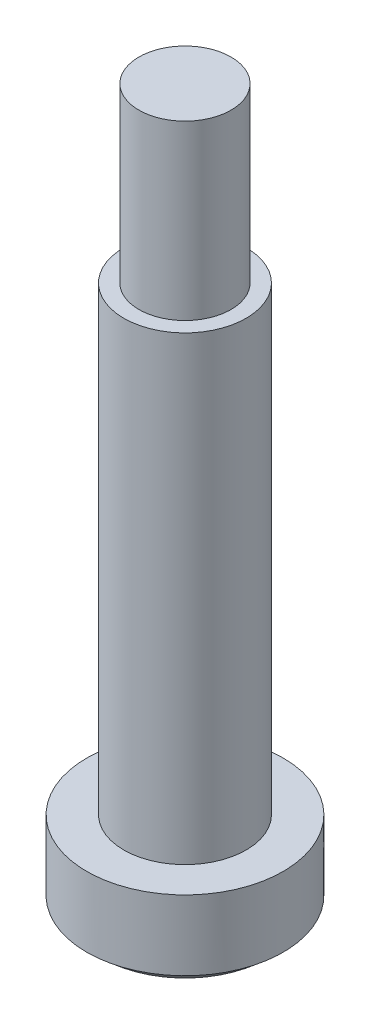
ISO-10303-21;
HEADER;
FILE_DESCRIPTION(('STEP AP214'),'2;1');
FILE_NAME('part.step','',(''),(''),'','','');
FILE_SCHEMA(('AUTOMOTIVE_DESIGN { 1 0 10303 214 1 1 1 1 }'));
ENDSEC;
DATA;
#1=APPLICATION_CONTEXT('core data for automotive mechanical design processes');
#2=APPLICATION_PROTOCOL_DEFINITION('international standard','automotive_design',2000,#1);
#3=PRODUCT_CONTEXT('',#1,'mechanical');
#4=PRODUCT('Part','Part','',(#3));
#5=PRODUCT_RELATED_PRODUCT_CATEGORY('part','',(#4));
#6=PRODUCT_DEFINITION_FORMATION('','',#4);
#7=PRODUCT_DEFINITION_CONTEXT('part definition',#1,'design');
#8=PRODUCT_DEFINITION('design','',#6,#7);
#9=PRODUCT_DEFINITION_SHAPE('','',#8);
#10=(LENGTH_UNIT() NAMED_UNIT(*) SI_UNIT(.MILLI.,.METRE.));
#11=(NAMED_UNIT(*) PLANE_ANGLE_UNIT() SI_UNIT($,.RADIAN.));
#12=(NAMED_UNIT(*) SI_UNIT($,.STERADIAN.) SOLID_ANGLE_UNIT());
#13=UNCERTAINTY_MEASURE_WITH_UNIT(LENGTH_MEASURE(1.E-05),#10,'distance_accuracy_value','');
#14=(GEOMETRIC_REPRESENTATION_CONTEXT(3) GLOBAL_UNCERTAINTY_ASSIGNED_CONTEXT((#13)) GLOBAL_UNIT_ASSIGNED_CONTEXT((#10,
#11,#12)) REPRESENTATION_CONTEXT('',''));
#15=CARTESIAN_POINT('',(0.,0.,0.));
#16=DIRECTION('',(0.,0.,1.));
#17=DIRECTION('',(1.,0.,0.));
#18=AXIS2_PLACEMENT_3D('',#15,#16,#17);
#19=CARTESIAN_POINT('',(0.,5.4,0.));
#20=DIRECTION('',(0.,-1.,0.));
#21=DIRECTION('',(0.,0.,-1.));
#22=AXIS2_PLACEMENT_3D('',#19,#20,#21);
#23=CYLINDRICAL_SURFACE('',#22,6.4);
#24=CARTESIAN_POINT('',(0.,0.839099631177299,0.));
#25=DIRECTION('',(0.,1.,0.));
#26=DIRECTION('',(0.,0.,1.));
#27=AXIS2_PLACEMENT_3D('',#24,#25,#26);
#28=CIRCLE('',#27,6.4);
#29=CARTESIAN_POINT('',(0.,0.839099631177298,-6.4));
#30=VERTEX_POINT('',#29);
#31=EDGE_CURVE('E50',#30,#30,#28,.T.);
#32=CARTESIAN_POINT('',(0.,5.4,0.));
#33=DIRECTION('',(0.,1.,0.));
#34=DIRECTION('',(0.,0.,1.));
#35=AXIS2_PLACEMENT_3D('',#32,#33,#34);
#36=CIRCLE('',#35,6.4);
#37=CARTESIAN_POINT('',(0.,5.4,-6.4));
#38=VERTEX_POINT('',#37);
#39=EDGE_CURVE('E159',#38,#38,#36,.T.);
#40=CARTESIAN_POINT('',(0.,0.839099631177298,-6.4));
#41=CARTESIAN_POINT('',(0.,0.886609010019201,-6.4));
#42=CARTESIAN_POINT('',(0.,0.934118388861105,-6.4));
#43=CARTESIAN_POINT('',(0.,1.02913714654491,-6.4));
#44=CARTESIAN_POINT('',(0.,1.07664652538681,-6.4));
#45=CARTESIAN_POINT('',(0.,1.17166528307062,-6.4));
#46=CARTESIAN_POINT('',(0.,1.21917466191252,-6.4));
#47=CARTESIAN_POINT('',(0.,1.31419341959633,-6.4));
#48=CARTESIAN_POINT('',(0.,1.36170279843823,-6.4));
#49=CARTESIAN_POINT('',(0.,1.45672155612204,-6.4));
#50=CARTESIAN_POINT('',(0.,1.50423093496394,-6.4));
#51=CARTESIAN_POINT('',(0.,1.59924969264775,-6.4));
#52=CARTESIAN_POINT('',(0.,1.64675907148965,-6.4));
#53=CARTESIAN_POINT('',(0.,1.74177782917346,-6.4));
#54=CARTESIAN_POINT('',(0.,1.78928720801536,-6.4));
#55=CARTESIAN_POINT('',(0.,1.88430596569917,-6.4));
#56=CARTESIAN_POINT('',(0.,1.93181534454107,-6.4));
#57=CARTESIAN_POINT('',(0.,2.02683410222488,-6.4));
#58=CARTESIAN_POINT('',(0.,2.07434348106678,-6.4));
#59=CARTESIAN_POINT('',(0.,2.16936223875059,-6.4));
#60=CARTESIAN_POINT('',(0.,2.21687161759249,-6.4));
#61=CARTESIAN_POINT('',(0.,2.3118903752763,-6.4));
#62=CARTESIAN_POINT('',(0.,2.3593997541182,-6.4));
#63=CARTESIAN_POINT('',(0.,2.45441851180201,-6.4));
#64=CARTESIAN_POINT('',(0.,2.50192789064391,-6.4));
#65=CARTESIAN_POINT('',(0.,2.59694664832771,-6.4));
#66=CARTESIAN_POINT('',(0.,2.64445602716962,-6.4));
#67=CARTESIAN_POINT('',(0.,2.73947478485342,-6.4));
#68=CARTESIAN_POINT('',(0.,2.78698416369533,-6.4));
#69=CARTESIAN_POINT('',(0.,2.88200292137913,-6.4));
#70=CARTESIAN_POINT('',(0.,2.92951230022104,-6.4));
#71=CARTESIAN_POINT('',(0.,3.02453105790484,-6.4));
#72=CARTESIAN_POINT('',(0.,3.07204043674675,-6.4));
#73=CARTESIAN_POINT('',(0.,3.16705919443055,-6.4));
#74=CARTESIAN_POINT('',(0.,3.21456857327246,-6.4));
#75=CARTESIAN_POINT('',(0.,3.30958733095626,-6.4));
#76=CARTESIAN_POINT('',(0.,3.35709670979816,-6.4));
#77=CARTESIAN_POINT('',(0.,3.45211546748197,-6.4));
#78=CARTESIAN_POINT('',(0.,3.49962484632387,-6.4));
#79=CARTESIAN_POINT('',(0.,3.59464360400768,-6.4));
#80=CARTESIAN_POINT('',(0.,3.64215298284958,-6.4));
#81=CARTESIAN_POINT('',(0.,3.73717174053339,-6.4));
#82=CARTESIAN_POINT('',(0.,3.78468111937529,-6.4));
#83=CARTESIAN_POINT('',(0.,3.8796998770591,-6.4));
#84=CARTESIAN_POINT('',(0.,3.927209255901,-6.4));
#85=CARTESIAN_POINT('',(0.,4.02222801358481,-6.4));
#86=CARTESIAN_POINT('',(0.,4.06973739242671,-6.4));
#87=CARTESIAN_POINT('',(0.,4.16475615011052,-6.4));
#88=CARTESIAN_POINT('',(0.,4.21226552895242,-6.4));
#89=CARTESIAN_POINT('',(0.,4.30728428663623,-6.4));
#90=CARTESIAN_POINT('',(0.,4.35479366547813,-6.4));
#91=CARTESIAN_POINT('',(0.,4.44981242316194,-6.4));
#92=CARTESIAN_POINT('',(0.,4.49732180200384,-6.4));
#93=CARTESIAN_POINT('',(0.,4.59234055968765,-6.4));
#94=CARTESIAN_POINT('',(0.,4.63984993852955,-6.4));
#95=CARTESIAN_POINT('',(0.,4.73486869621336,-6.4));
#96=CARTESIAN_POINT('',(0.,4.78237807505526,-6.4));
#97=CARTESIAN_POINT('',(0.,4.87739683273907,-6.4));
#98=CARTESIAN_POINT('',(0.,4.92490621158097,-6.4));
#99=CARTESIAN_POINT('',(0.,5.01992496926478,-6.4));
#100=CARTESIAN_POINT('',(0.,5.06743434810668,-6.4));
#101=CARTESIAN_POINT('',(0.,5.16245310579048,-6.4));
#102=CARTESIAN_POINT('',(0.,5.20996248463239,-6.4));
#103=CARTESIAN_POINT('',(0.,5.30498124231619,-6.4));
#104=CARTESIAN_POINT('',(0.,5.3524906211581,-6.4));
#105=CARTESIAN_POINT('',(0.,5.4,-6.4));
#106=B_SPLINE_CURVE_WITH_KNOTS('',3,(#40,#41,#42,#43,#44,#45,#46,#47,#48,#49,#50,#51,#52,#53,
#54,#55,#56,#57,#58,#59,#60,#61,#62,#63,#64,#65,#66,#67,#68,#69,#70,#71,#72,#73,#74,#75,#76,#77,
#78,#79,#80,#81,#82,#83,#84,#85,#86,#87,#88,#89,#90,#91,#92,#93,#94,#95,#96,#97,#98,#99,#100,
#101,#102,#103,#104,#105),.UNSPECIFIED.,.F.,.F.,(4,2,2,2,2,2,2,2,2,2,2,2,2,2,2,2,2,2,2,2,2,2,2,
2,2,2,2,2,2,2,2,2,4),(0.,0.142528136525709,0.285056273051419,0.427584409577128,
0.570112546102838,0.712640682628547,0.855168819154256,0.997696955679966,1.14022509220568,
1.28275322873138,1.42528136525709,1.5678095017828,1.71033763830851,1.85286577483422,
1.99539391135993,2.13792204788564,2.28045018441135,2.42297832093706,2.56550645746277,
2.70803459398848,2.85056273051419,2.9930908670399,3.13561900356561,3.27814714009132,
3.42067527661703,3.56320341314274,3.70573154966845,3.84825968619415,3.99078782271986,
4.13331595924557,4.27584409577128,4.41837223229699,4.5609003688227),.UNSPECIFIED.);
#107=EDGE_CURVE('BSEAM41',#30,#38,#106,.T.);
#108=ORIENTED_EDGE('',*,*,#31,.T.);
#109=ORIENTED_EDGE('',*,*,#39,.F.);
#110=ORIENTED_EDGE('',*,*,#107,.T.);
#111=ORIENTED_EDGE('',*,*,#107,.F.);
#112=EDGE_LOOP('',(#108,#110,#109,#111));
#113=FACE_BOUND('',#112,.T.);
#114=ADVANCED_FACE('F41',(#113),#23,.T.);
#115=CARTESIAN_POINT('',(0.,5.4,0.));
#116=DIRECTION('',(0.,1.,0.));
#117=DIRECTION('',(0.,0.,1.));
#118=AXIS2_PLACEMENT_3D('',#115,#116,#117);
#119=PLANE('',#118);
#120=CARTESIAN_POINT('',(0.,5.4,0.));
#121=DIRECTION('',(0.,1.,0.));
#122=DIRECTION('',(0.,0.,1.));
#123=AXIS2_PLACEMENT_3D('',#120,#121,#122);
#124=CIRCLE('',#123,3.985);
#125=CARTESIAN_POINT('',(0.,5.4,3.985));
#126=VERTEX_POINT('',#125);
#127=EDGE_CURVE('E156',#126,#126,#124,.T.);
#128=ORIENTED_EDGE('',*,*,#127,.F.);
#129=EDGE_LOOP('',(#128));
#130=FACE_BOUND('',#129,.T.);
#131=ORIENTED_EDGE('',*,*,#39,.T.);
#132=EDGE_LOOP('',(#131));
#133=FACE_BOUND('',#132,.T.);
#134=ADVANCED_FACE('F183',(#130,#133),#119,.T.);
#135=CARTESIAN_POINT('',(0.,0.,0.));
#136=DIRECTION('',(0.,1.,0.));
#137=DIRECTION('',(0.,0.,1.));
#138=AXIS2_PLACEMENT_3D('',#135,#136,#137);
#139=PLANE('',#138);
#140=DIRECTION('',(-0.866025403784438,0.,-0.5));
#141=VECTOR('',#140,1.);
#142=CARTESIAN_POINT('',(0.,0.,2.30940107675851));
#143=LINE('',#142,#141);
#144=CARTESIAN_POINT('',(0.,0.,2.30940107675851));
#145=VERTEX_POINT('',#144);
#146=CARTESIAN_POINT('',(-2.,0.,1.15470053837925));
#147=VERTEX_POINT('',#146);
#148=EDGE_CURVE('E131',#145,#147,#143,.T.);
#149=ORIENTED_EDGE('',*,*,#148,.F.);
#150=DIRECTION('',(-0.866025403784438,0.,0.5));
#151=VECTOR('',#150,1.);
#152=CARTESIAN_POINT('',(2.,0.,1.15470053837925));
#153=LINE('',#152,#151);
#154=CARTESIAN_POINT('',(2.,0.,1.15470053837925));
#155=VERTEX_POINT('',#154);
#156=EDGE_CURVE('E57',#155,#145,#153,.T.);
#157=ORIENTED_EDGE('',*,*,#156,.F.);
#158=DIRECTION('',(0.,0.,1.));
#159=VECTOR('',#158,1.);
#160=CARTESIAN_POINT('',(2.,0.,-1.15470053837925));
#161=LINE('',#160,#159);
#162=CARTESIAN_POINT('',(2.,0.,-1.15470053837925));
#163=VERTEX_POINT('',#162);
#164=EDGE_CURVE('E140',#163,#155,#161,.T.);
#165=ORIENTED_EDGE('',*,*,#164,.F.);
#166=DIRECTION('',(0.866025403784439,0.,0.5));
#167=VECTOR('',#166,1.);
#168=CARTESIAN_POINT('',(0.,0.,-2.30940107675851));
#169=LINE('',#168,#167);
#170=CARTESIAN_POINT('',(0.,0.,-2.30940107675851));
#171=VERTEX_POINT('',#170);
#172=EDGE_CURVE('E138',#171,#163,#169,.T.);
#173=ORIENTED_EDGE('',*,*,#172,.F.);
#174=DIRECTION('',(0.866025403784438,0.,-0.5));
#175=VECTOR('',#174,1.);
#176=CARTESIAN_POINT('',(-2.,0.,-1.15470053837925));
#177=LINE('',#176,#175);
#178=CARTESIAN_POINT('',(-2.,0.,-1.15470053837925));
#179=VERTEX_POINT('',#178);
#180=EDGE_CURVE('E105',#179,#171,#177,.T.);
#181=ORIENTED_EDGE('',*,*,#180,.F.);
#182=DIRECTION('',(0.,0.,-1.));
#183=VECTOR('',#182,1.);
#184=CARTESIAN_POINT('',(-2.,0.,1.15470053837925));
#185=LINE('',#184,#183);
#186=EDGE_CURVE('E134',#147,#179,#185,.T.);
#187=ORIENTED_EDGE('',*,*,#186,.F.);
#188=EDGE_LOOP('',(#149,#157,#165,#173,#181,#187));
#189=FACE_BOUND('',#188,.T.);
#190=CARTESIAN_POINT('',(0.,0.,0.));
#191=DIRECTION('',(0.,1.,0.));
#192=DIRECTION('',(0.,0.,1.));
#193=AXIS2_PLACEMENT_3D('',#190,#191,#192);
#194=CIRCLE('',#193,5.39999999999997);
#195=CARTESIAN_POINT('',(0.,0.,5.39999999999997));
#196=VERTEX_POINT('',#195);
#197=EDGE_CURVE('E11',#196,#196,#194,.F.);
#198=ORIENTED_EDGE('',*,*,#197,.T.);
#199=EDGE_LOOP('',(#198));
#200=FACE_BOUND('',#199,.T.);
#201=ADVANCED_FACE('F187',(#189,#200),#139,.F.);
#202=CARTESIAN_POINT('',(0.,35.4,0.));
#203=DIRECTION('',(0.,-1.,0.));
#204=DIRECTION('',(0.,0.,-1.));
#205=AXIS2_PLACEMENT_3D('',#202,#203,#204);
#206=CYLINDRICAL_SURFACE('',#205,3.985);
#207=CARTESIAN_POINT('',(0.,35.4,0.));
#208=DIRECTION('',(0.,1.,0.));
#209=DIRECTION('',(0.,0.,1.));
#210=AXIS2_PLACEMENT_3D('',#207,#208,#209);
#211=CIRCLE('',#210,3.985);
#212=CARTESIAN_POINT('',(0.,35.4,3.985));
#213=VERTEX_POINT('',#212);
#214=EDGE_CURVE('E152',#213,#213,#211,.T.);
#215=ORIENTED_EDGE('',*,*,#214,.F.);
#216=EDGE_LOOP('',(#215));
#217=FACE_BOUND('',#216,.T.);
#218=ORIENTED_EDGE('',*,*,#127,.T.);
#219=EDGE_LOOP('',(#218));
#220=FACE_BOUND('',#219,.T.);
#221=ADVANCED_FACE('F192',(#217,#220),#206,.T.);
#222=CARTESIAN_POINT('',(0.,35.4,0.));
#223=DIRECTION('',(0.,1.,0.));
#224=DIRECTION('',(0.,0.,1.));
#225=AXIS2_PLACEMENT_3D('',#222,#223,#224);
#226=PLANE('',#225);
#227=CARTESIAN_POINT('',(0.,35.4,0.));
#228=DIRECTION('',(0.,1.,0.));
#229=DIRECTION('',(0.,0.,1.));
#230=AXIS2_PLACEMENT_3D('',#227,#228,#229);
#231=CIRCLE('',#230,3.);
#232=CARTESIAN_POINT('',(0.,35.4,-3.));
#233=VERTEX_POINT('',#232);
#234=EDGE_CURVE('E153',#233,#233,#231,.T.);
#235=ORIENTED_EDGE('',*,*,#234,.F.);
#236=EDGE_LOOP('',(#235));
#237=FACE_BOUND('',#236,.T.);
#238=ORIENTED_EDGE('',*,*,#214,.T.);
#239=EDGE_LOOP('',(#238));
#240=FACE_BOUND('',#239,.T.);
#241=ADVANCED_FACE('F197',(#237,#240),#226,.T.);
#242=CARTESIAN_POINT('',(0.,46.65,0.));
#243=DIRECTION('',(0.,-1.,0.));
#244=DIRECTION('',(0.,0.,-1.));
#245=AXIS2_PLACEMENT_3D('',#242,#243,#244);
#246=CYLINDRICAL_SURFACE('',#245,3.);
#247=CARTESIAN_POINT('',(0.,46.65,0.));
#248=DIRECTION('',(0.,1.,0.));
#249=DIRECTION('',(0.,0.,1.));
#250=AXIS2_PLACEMENT_3D('',#247,#248,#249);
#251=CIRCLE('',#250,3.);
#252=CARTESIAN_POINT('',(0.,46.65,-3.));
#253=VERTEX_POINT('',#252);
#254=EDGE_CURVE('E144',#253,#253,#251,.T.);
#255=CARTESIAN_POINT('',(0.,46.65,-3.));
#256=CARTESIAN_POINT('',(0.,46.5328125,-3.));
#257=CARTESIAN_POINT('',(0.,46.415625,-3.));
#258=CARTESIAN_POINT('',(0.,46.18125,-3.));
#259=CARTESIAN_POINT('',(0.,46.0640625,-3.));
#260=CARTESIAN_POINT('',(0.,45.8296875,-3.));
#261=CARTESIAN_POINT('',(0.,45.7125,-3.));
#262=CARTESIAN_POINT('',(0.,45.478125,-3.));
#263=CARTESIAN_POINT('',(0.,45.3609375,-3.));
#264=CARTESIAN_POINT('',(0.,45.1265625,-3.));
#265=CARTESIAN_POINT('',(0.,45.009375,-3.));
#266=CARTESIAN_POINT('',(0.,44.775,-3.));
#267=CARTESIAN_POINT('',(0.,44.6578125,-3.));
#268=CARTESIAN_POINT('',(0.,44.4234375,-3.));
#269=CARTESIAN_POINT('',(0.,44.30625,-3.));
#270=CARTESIAN_POINT('',(0.,44.071875,-3.));
#271=CARTESIAN_POINT('',(0.,43.9546875,-3.));
#272=CARTESIAN_POINT('',(0.,43.7203125,-3.));
#273=CARTESIAN_POINT('',(0.,43.603125,-3.));
#274=CARTESIAN_POINT('',(0.,43.36875,-3.));
#275=CARTESIAN_POINT('',(0.,43.2515625,-3.));
#276=CARTESIAN_POINT('',(0.,43.0171875,-3.));
#277=CARTESIAN_POINT('',(0.,42.9,-3.));
#278=CARTESIAN_POINT('',(0.,42.665625,-3.));
#279=CARTESIAN_POINT('',(0.,42.5484375,-3.));
#280=CARTESIAN_POINT('',(0.,42.3140625,-3.));
#281=CARTESIAN_POINT('',(0.,42.196875,-3.));
#282=CARTESIAN_POINT('',(0.,41.9625,-3.));
#283=CARTESIAN_POINT('',(0.,41.8453125,-3.));
#284=CARTESIAN_POINT('',(0.,41.6109375,-3.));
#285=CARTESIAN_POINT('',(0.,41.49375,-3.));
#286=CARTESIAN_POINT('',(0.,41.259375,-3.));
#287=CARTESIAN_POINT('',(0.,41.1421875,-3.));
#288=CARTESIAN_POINT('',(0.,40.9078125,-3.));
#289=CARTESIAN_POINT('',(0.,40.790625,-3.));
#290=CARTESIAN_POINT('',(0.,40.55625,-3.));
#291=CARTESIAN_POINT('',(0.,40.4390625,-3.));
#292=CARTESIAN_POINT('',(0.,40.2046875,-3.));
#293=CARTESIAN_POINT('',(0.,40.0875,-3.));
#294=CARTESIAN_POINT('',(0.,39.853125,-3.));
#295=CARTESIAN_POINT('',(0.,39.7359375,-3.));
#296=CARTESIAN_POINT('',(0.,39.5015625,-3.));
#297=CARTESIAN_POINT('',(0.,39.384375,-3.));
#298=CARTESIAN_POINT('',(0.,39.15,-3.));
#299=CARTESIAN_POINT('',(0.,39.0328125,-3.));
#300=CARTESIAN_POINT('',(0.,38.7984375,-3.));
#301=CARTESIAN_POINT('',(0.,38.68125,-3.));
#302=CARTESIAN_POINT('',(0.,38.446875,-3.));
#303=CARTESIAN_POINT('',(0.,38.3296875,-3.));
#304=CARTESIAN_POINT('',(0.,38.0953125,-3.));
#305=CARTESIAN_POINT('',(0.,37.978125,-3.));
#306=CARTESIAN_POINT('',(0.,37.74375,-3.));
#307=CARTESIAN_POINT('',(0.,37.6265625,-3.));
#308=CARTESIAN_POINT('',(0.,37.3921875,-3.));
#309=CARTESIAN_POINT('',(0.,37.275,-3.));
#310=CARTESIAN_POINT('',(0.,37.040625,-3.));
#311=CARTESIAN_POINT('',(0.,36.9234375,-3.));
#312=CARTESIAN_POINT('',(0.,36.6890625,-3.));
#313=CARTESIAN_POINT('',(0.,36.571875,-3.));
#314=CARTESIAN_POINT('',(0.,36.3375,-3.));
#315=CARTESIAN_POINT('',(0.,36.2203125,-3.));
#316=CARTESIAN_POINT('',(0.,35.9859375,-3.));
#317=CARTESIAN_POINT('',(0.,35.86875,-3.));
#318=CARTESIAN_POINT('',(0.,35.634375,-3.));
#319=CARTESIAN_POINT('',(0.,35.5171875,-3.));
#320=CARTESIAN_POINT('',(0.,35.4,-3.));
#321=B_SPLINE_CURVE_WITH_KNOTS('',3,(#255,#256,#257,#258,#259,#260,#261,#262,#263,#264,#265,
#266,#267,#268,#269,#270,#271,#272,#273,#274,#275,#276,#277,#278,#279,#280,#281,#282,#283,#284,
#285,#286,#287,#288,#289,#290,#291,#292,#293,#294,#295,#296,#297,#298,#299,#300,#301,#302,#303,
#304,#305,#306,#307,#308,#309,#310,#311,#312,#313,#314,#315,#316,#317,#318,#319,#320),
.UNSPECIFIED.,.F.,.F.,(4,2,2,2,2,2,2,2,2,2,2,2,2,2,2,2,2,2,2,2,2,2,2,2,2,2,2,2,2,2,2,2,4),(0.,
0.351562499999999,0.703124999999999,1.0546875,1.40625,1.7578125,2.109375,2.4609375,2.8125,
3.1640625,3.51562499999999,3.86718749999999,4.21874999999999,4.57031249999999,4.921875,
5.2734375,5.625,5.9765625,6.328125,6.6796875,7.03125,7.3828125,7.73437499999999,
8.08593749999999,8.43749999999999,8.78906249999999,9.14062499999999,9.49218749999999,
9.84374999999999,10.1953125,10.546875,10.8984375,11.25),.UNSPECIFIED.);
#322=EDGE_CURVE('BSEAM178',#253,#233,#321,.T.);
#323=ORIENTED_EDGE('',*,*,#254,.F.);
#324=ORIENTED_EDGE('',*,*,#234,.T.);
#325=ORIENTED_EDGE('',*,*,#322,.T.);
#326=ORIENTED_EDGE('',*,*,#322,.F.);
#327=EDGE_LOOP('',(#323,#325,#324,#326));
#328=FACE_BOUND('',#327,.T.);
#329=ADVANCED_FACE('F178',(#328),#246,.T.);
#330=CARTESIAN_POINT('',(0.,46.65,0.));
#331=DIRECTION('',(0.,1.,0.));
#332=DIRECTION('',(0.,0.,1.));
#333=AXIS2_PLACEMENT_3D('',#330,#331,#332);
#334=PLANE('',#333);
#335=ORIENTED_EDGE('',*,*,#254,.T.);
#336=EDGE_LOOP('',(#335));
#337=FACE_BOUND('',#336,.T.);
#338=ADVANCED_FACE('F170',(#337),#334,.T.);
#339=CARTESIAN_POINT('',(0.,0.839099631177298,0.));
#340=DIRECTION('',(0.,1.,0.));
#341=DIRECTION('',(0.,0.,1.));
#342=AXIS2_PLACEMENT_3D('',#339,#340,#341);
#343=CONICAL_SURFACE('',#342,6.4,0.872664625997167);
#344=ORIENTED_EDGE('',*,*,#197,.F.);
#345=EDGE_LOOP('',(#344));
#346=FACE_BOUND('',#345,.T.);
#347=ORIENTED_EDGE('',*,*,#31,.F.);
#348=EDGE_LOOP('',(#347));
#349=FACE_BOUND('',#348,.T.);
#350=ADVANCED_FACE('F44',(#346,#349),#343,.T.);
#351=CARTESIAN_POINT('',(2.,3.,1.15470053837925));
#352=DIRECTION('',(0.5,0.,0.866025403784438));
#353=DIRECTION('',(0.866025403784438,0.,-0.5));
#354=AXIS2_PLACEMENT_3D('',#351,#352,#353);
#355=PLANE('',#354);
#356=ORIENTED_EDGE('',*,*,#156,.T.);
#357=DIRECTION('',(0.,-1.,0.));
#358=VECTOR('',#357,1.);
#359=CARTESIAN_POINT('',(0.,3.,2.30940107675851));
#360=LINE('',#359,#358);
#361=CARTESIAN_POINT('',(0.,3.,2.30940107675851));
#362=VERTEX_POINT('',#361);
#363=EDGE_CURVE('E87',#362,#145,#360,.T.);
#364=ORIENTED_EDGE('',*,*,#363,.F.);
#365=DIRECTION('',(-0.866025403784438,0.,0.5));
#366=VECTOR('',#365,1.);
#367=CARTESIAN_POINT('',(2.,3.,1.15470053837925));
#368=LINE('',#367,#366);
#369=CARTESIAN_POINT('',(2.,3.,1.15470053837925));
#370=VERTEX_POINT('',#369);
#371=EDGE_CURVE('E142',#370,#362,#368,.T.);
#372=ORIENTED_EDGE('',*,*,#371,.F.);
#373=DIRECTION('',(0.,-1.,0.));
#374=VECTOR('',#373,1.);
#375=CARTESIAN_POINT('',(2.,3.,1.15470053837925));
#376=LINE('',#375,#374);
#377=EDGE_CURVE('E65',#370,#155,#376,.T.);
#378=ORIENTED_EDGE('',*,*,#377,.T.);
#379=EDGE_LOOP('',(#356,#364,#372,#378));
#380=FACE_BOUND('',#379,.T.);
#381=ADVANCED_FACE('F169',(#380),#355,.F.);
#382=CARTESIAN_POINT('',(2.,3.,-1.15470053837925));
#383=DIRECTION('',(1.,0.,0.));
#384=DIRECTION('',(0.,0.,-1.));
#385=AXIS2_PLACEMENT_3D('',#382,#383,#384);
#386=PLANE('',#385);
#387=ORIENTED_EDGE('',*,*,#164,.T.);
#388=ORIENTED_EDGE('',*,*,#377,.F.);
#389=DIRECTION('',(0.,0.,1.));
#390=VECTOR('',#389,1.);
#391=CARTESIAN_POINT('',(2.,3.,-1.15470053837925));
#392=LINE('',#391,#390);
#393=CARTESIAN_POINT('',(2.,3.,-1.15470053837925));
#394=VERTEX_POINT('',#393);
#395=EDGE_CURVE('E117',#394,#370,#392,.T.);
#396=ORIENTED_EDGE('',*,*,#395,.F.);
#397=DIRECTION('',(0.,-1.,0.));
#398=VECTOR('',#397,1.);
#399=CARTESIAN_POINT('',(2.,3.,-1.15470053837925));
#400=LINE('',#399,#398);
#401=EDGE_CURVE('E109',#394,#163,#400,.T.);
#402=ORIENTED_EDGE('',*,*,#401,.T.);
#403=EDGE_LOOP('',(#387,#388,#396,#402));
#404=FACE_BOUND('',#403,.T.);
#405=ADVANCED_FACE('F176',(#404),#386,.F.);
#406=CARTESIAN_POINT('',(0.,3.,-2.30940107675851));
#407=DIRECTION('',(0.5,0.,-0.866025403784439));
#408=DIRECTION('',(-0.866025403784439,0.,-0.5));
#409=AXIS2_PLACEMENT_3D('',#406,#407,#408);
#410=PLANE('',#409);
#411=ORIENTED_EDGE('',*,*,#172,.T.);
#412=ORIENTED_EDGE('',*,*,#401,.F.);
#413=DIRECTION('',(0.866025403784439,0.,0.5));
#414=VECTOR('',#413,1.);
#415=CARTESIAN_POINT('',(0.,3.,-2.30940107675851));
#416=LINE('',#415,#414);
#417=CARTESIAN_POINT('',(0.,3.,-2.30940107675851));
#418=VERTEX_POINT('',#417);
#419=EDGE_CURVE('E113',#418,#394,#416,.T.);
#420=ORIENTED_EDGE('',*,*,#419,.F.);
#421=DIRECTION('',(0.,-1.,0.));
#422=VECTOR('',#421,1.);
#423=CARTESIAN_POINT('',(0.,3.,-2.30940107675851));
#424=LINE('',#423,#422);
#425=EDGE_CURVE('E98',#418,#171,#424,.T.);
#426=ORIENTED_EDGE('',*,*,#425,.T.);
#427=EDGE_LOOP('',(#411,#412,#420,#426));
#428=FACE_BOUND('',#427,.T.);
#429=ADVANCED_FACE('F114',(#428),#410,.F.);
#430=CARTESIAN_POINT('',(-2.,3.,-1.15470053837925));
#431=DIRECTION('',(-0.5,0.,-0.866025403784439));
#432=DIRECTION('',(-0.866025403784439,0.,0.5));
#433=AXIS2_PLACEMENT_3D('',#430,#431,#432);
#434=PLANE('',#433);
#435=ORIENTED_EDGE('',*,*,#180,.T.);
#436=ORIENTED_EDGE('',*,*,#425,.F.);
#437=DIRECTION('',(0.866025403784438,0.,-0.5));
#438=VECTOR('',#437,1.);
#439=CARTESIAN_POINT('',(-2.,3.,-1.15470053837925));
#440=LINE('',#439,#438);
#441=CARTESIAN_POINT('',(-2.,3.,-1.15470053837925));
#442=VERTEX_POINT('',#441);
#443=EDGE_CURVE('E102',#442,#418,#440,.T.);
#444=ORIENTED_EDGE('',*,*,#443,.F.);
#445=DIRECTION('',(0.,-1.,0.));
#446=VECTOR('',#445,1.);
#447=CARTESIAN_POINT('',(-2.,3.,-1.15470053837925));
#448=LINE('',#447,#446);
#449=EDGE_CURVE('E110',#442,#179,#448,.T.);
#450=ORIENTED_EDGE('',*,*,#449,.T.);
#451=EDGE_LOOP('',(#435,#436,#444,#450));
#452=FACE_BOUND('',#451,.T.);
#453=ADVANCED_FACE('F100',(#452),#434,.F.);
#454=CARTESIAN_POINT('',(-2.,3.,1.15470053837925));
#455=DIRECTION('',(-1.,0.,0.));
#456=DIRECTION('',(0.,0.,1.));
#457=AXIS2_PLACEMENT_3D('',#454,#455,#456);
#458=PLANE('',#457);
#459=ORIENTED_EDGE('',*,*,#186,.T.);
#460=ORIENTED_EDGE('',*,*,#449,.F.);
#461=DIRECTION('',(0.,0.,-1.));
#462=VECTOR('',#461,1.);
#463=CARTESIAN_POINT('',(-2.,3.,1.15470053837925));
#464=LINE('',#463,#462);
#465=CARTESIAN_POINT('',(-2.,3.,1.15470053837925));
#466=VERTEX_POINT('',#465);
#467=EDGE_CURVE('E123',#466,#442,#464,.T.);
#468=ORIENTED_EDGE('',*,*,#467,.F.);
#469=DIRECTION('',(0.,-1.,0.));
#470=VECTOR('',#469,1.);
#471=CARTESIAN_POINT('',(-2.,3.,1.15470053837925));
#472=LINE('',#471,#470);
#473=EDGE_CURVE('E147',#466,#147,#472,.T.);
#474=ORIENTED_EDGE('',*,*,#473,.T.);
#475=EDGE_LOOP('',(#459,#460,#468,#474));
#476=FACE_BOUND('',#475,.T.);
#477=ADVANCED_FACE('F208',(#476),#458,.F.);
#478=CARTESIAN_POINT('',(0.,3.,2.30940107675851));
#479=DIRECTION('',(-0.5,0.,0.866025403784439));
#480=DIRECTION('',(0.866025403784439,0.,0.5));
#481=AXIS2_PLACEMENT_3D('',#478,#479,#480);
#482=PLANE('',#481);
#483=ORIENTED_EDGE('',*,*,#148,.T.);
#484=ORIENTED_EDGE('',*,*,#473,.F.);
#485=DIRECTION('',(-0.866025403784438,0.,-0.5));
#486=VECTOR('',#485,1.);
#487=CARTESIAN_POINT('',(0.,3.,2.30940107675851));
#488=LINE('',#487,#486);
#489=EDGE_CURVE('E125',#362,#466,#488,.T.);
#490=ORIENTED_EDGE('',*,*,#489,.F.);
#491=ORIENTED_EDGE('',*,*,#363,.T.);
#492=EDGE_LOOP('',(#483,#484,#490,#491));
#493=FACE_BOUND('',#492,.T.);
#494=ADVANCED_FACE('F205',(#493),#482,.F.);
#495=CARTESIAN_POINT('',(0.,3.,0.));
#496=DIRECTION('',(0.,-1.,0.));
#497=DIRECTION('',(0.,0.,-1.));
#498=AXIS2_PLACEMENT_3D('',#495,#496,#497);
#499=PLANE('',#498);
#500=ORIENTED_EDGE('',*,*,#371,.T.);
#501=ORIENTED_EDGE('',*,*,#489,.T.);
#502=ORIENTED_EDGE('',*,*,#467,.T.);
#503=ORIENTED_EDGE('',*,*,#443,.T.);
#504=ORIENTED_EDGE('',*,*,#419,.T.);
#505=ORIENTED_EDGE('',*,*,#395,.T.);
#506=EDGE_LOOP('',(#500,#501,#502,#503,#504,#505));
#507=FACE_BOUND('',#506,.T.);
#508=ADVANCED_FACE('F120',(#507),#499,.T.);
#509=CLOSED_SHELL('',(#114,#134,#201,#221,#241,#329,#338,#350,#381,#405,#429,#453,#477,#494,#508));
#510=MANIFOLD_SOLID_BREP('B2',#509);
#511=ADVANCED_BREP_SHAPE_REPRESENTATION('',(#18,#510),#14);
#512=SHAPE_DEFINITION_REPRESENTATION(#9,#511);
ENDSEC;
END-ISO-10303-21;
